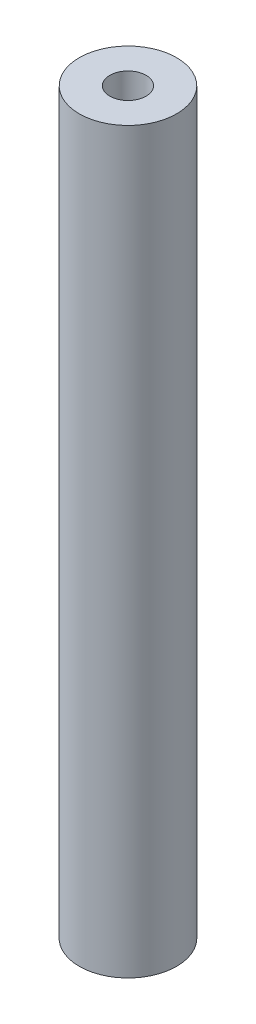
ISO-10303-21;
HEADER;
FILE_DESCRIPTION(('STEP AP214'),'2;1');
FILE_NAME('part.step','',(''),(''),'','','');
FILE_SCHEMA(('AUTOMOTIVE_DESIGN { 1 0 10303 214 1 1 1 1 }'));
ENDSEC;
DATA;
#1=APPLICATION_CONTEXT('core data for automotive mechanical design processes');
#2=APPLICATION_PROTOCOL_DEFINITION('international standard','automotive_design',2000,#1);
#3=PRODUCT_CONTEXT('',#1,'mechanical');
#4=PRODUCT('Part','Part','',(#3));
#5=PRODUCT_RELATED_PRODUCT_CATEGORY('part','',(#4));
#6=PRODUCT_DEFINITION_FORMATION('','',#4);
#7=PRODUCT_DEFINITION_CONTEXT('part definition',#1,'design');
#8=PRODUCT_DEFINITION('design','',#6,#7);
#9=PRODUCT_DEFINITION_SHAPE('','',#8);
#10=(LENGTH_UNIT() NAMED_UNIT(*) SI_UNIT(.MILLI.,.METRE.));
#11=(NAMED_UNIT(*) PLANE_ANGLE_UNIT() SI_UNIT($,.RADIAN.));
#12=(NAMED_UNIT(*) SI_UNIT($,.STERADIAN.) SOLID_ANGLE_UNIT());
#13=UNCERTAINTY_MEASURE_WITH_UNIT(LENGTH_MEASURE(1.E-05),#10,'distance_accuracy_value','');
#14=(GEOMETRIC_REPRESENTATION_CONTEXT(3) GLOBAL_UNCERTAINTY_ASSIGNED_CONTEXT((#13)) GLOBAL_UNIT_ASSIGNED_CONTEXT((#10,
#11,#12)) REPRESENTATION_CONTEXT('',''));
#15=CARTESIAN_POINT('',(0.,0.,0.));
#16=DIRECTION('',(0.,0.,1.));
#17=DIRECTION('',(1.,0.,0.));
#18=AXIS2_PLACEMENT_3D('',#15,#16,#17);
#19=CARTESIAN_POINT('',(0.,110.,0.));
#20=DIRECTION('',(0.,-1.,0.));
#21=DIRECTION('',(0.,0.,-1.));
#22=AXIS2_PLACEMENT_3D('',#19,#20,#21);
#23=CYLINDRICAL_SURFACE('',#22,7.25);
#24=CARTESIAN_POINT('',(0.,110.,0.));
#25=DIRECTION('',(0.,1.,0.));
#26=DIRECTION('',(0.,0.,1.));
#27=AXIS2_PLACEMENT_3D('',#24,#25,#26);
#28=CIRCLE('',#27,7.25);
#29=CARTESIAN_POINT('',(0.,110.,7.25));
#30=VERTEX_POINT('',#29);
#31=EDGE_CURVE('E10',#30,#30,#28,.T.);
#32=ORIENTED_EDGE('',*,*,#31,.F.);
#33=EDGE_LOOP('',(#32));
#34=FACE_BOUND('',#33,.T.);
#35=CARTESIAN_POINT('',(0.,0.,0.));
#36=DIRECTION('',(0.,1.,0.));
#37=DIRECTION('',(0.,0.,1.));
#38=AXIS2_PLACEMENT_3D('',#35,#36,#37);
#39=CIRCLE('',#38,7.25);
#40=CARTESIAN_POINT('',(0.,0.,7.25));
#41=VERTEX_POINT('',#40);
#42=EDGE_CURVE('E46',#41,#41,#39,.T.);
#43=ORIENTED_EDGE('',*,*,#42,.T.);
#44=EDGE_LOOP('',(#43));
#45=FACE_BOUND('',#44,.T.);
#46=ADVANCED_FACE('F43',(#34,#45),#23,.T.);
#47=CARTESIAN_POINT('',(0.,110.,0.));
#48=DIRECTION('',(0.,1.,0.));
#49=DIRECTION('',(0.,0.,1.));
#50=AXIS2_PLACEMENT_3D('',#47,#48,#49);
#51=PLANE('',#50);
#52=CARTESIAN_POINT('',(0.,110.,0.));
#53=DIRECTION('',(0.,1.,0.));
#54=DIRECTION('',(0.,0.,1.));
#55=AXIS2_PLACEMENT_3D('',#52,#53,#54);
#56=CIRCLE('',#55,2.7);
#57=CARTESIAN_POINT('',(0.,110.,2.7));
#58=VERTEX_POINT('',#57);
#59=EDGE_CURVE('E57',#58,#58,#56,.T.);
#60=ORIENTED_EDGE('',*,*,#59,.F.);
#61=EDGE_LOOP('',(#60));
#62=FACE_BOUND('',#61,.T.);
#63=ORIENTED_EDGE('',*,*,#31,.T.);
#64=EDGE_LOOP('',(#63));
#65=FACE_BOUND('',#64,.T.);
#66=ADVANCED_FACE('F74',(#62,#65),#51,.T.);
#67=CARTESIAN_POINT('',(0.,0.,0.));
#68=DIRECTION('',(0.,1.,0.));
#69=DIRECTION('',(0.,0.,1.));
#70=AXIS2_PLACEMENT_3D('',#67,#68,#69);
#71=PLANE('',#70);
#72=CARTESIAN_POINT('',(0.,0.,0.));
#73=DIRECTION('',(0.,1.,0.));
#74=DIRECTION('',(0.,0.,1.));
#75=AXIS2_PLACEMENT_3D('',#72,#73,#74);
#76=CIRCLE('',#75,2.7);
#77=CARTESIAN_POINT('',(0.,0.,2.7));
#78=VERTEX_POINT('',#77);
#79=EDGE_CURVE('E55',#78,#78,#76,.T.);
#80=ORIENTED_EDGE('',*,*,#79,.T.);
#81=EDGE_LOOP('',(#80));
#82=FACE_BOUND('',#81,.T.);
#83=ORIENTED_EDGE('',*,*,#42,.F.);
#84=EDGE_LOOP('',(#83));
#85=FACE_BOUND('',#84,.T.);
#86=ADVANCED_FACE('F65',(#82,#85),#71,.F.);
#87=CARTESIAN_POINT('',(0.,0.,0.));
#88=DIRECTION('',(0.,1.,0.));
#89=DIRECTION('',(0.,0.,1.));
#90=AXIS2_PLACEMENT_3D('',#87,#88,#89);
#91=CYLINDRICAL_SURFACE('',#90,2.7);
#92=ORIENTED_EDGE('',*,*,#79,.F.);
#93=EDGE_LOOP('',(#92));
#94=FACE_BOUND('',#93,.T.);
#95=ORIENTED_EDGE('',*,*,#59,.T.);
#96=EDGE_LOOP('',(#95));
#97=FACE_BOUND('',#96,.T.);
#98=ADVANCED_FACE('F68',(#94,#97),#91,.F.);
#99=CLOSED_SHELL('',(#46,#66,#86,#98));
#100=MANIFOLD_SOLID_BREP('B2',#99);
#101=ADVANCED_BREP_SHAPE_REPRESENTATION('',(#18,#100),#14);
#102=SHAPE_DEFINITION_REPRESENTATION(#9,#101);
ENDSEC;
END-ISO-10303-21;
